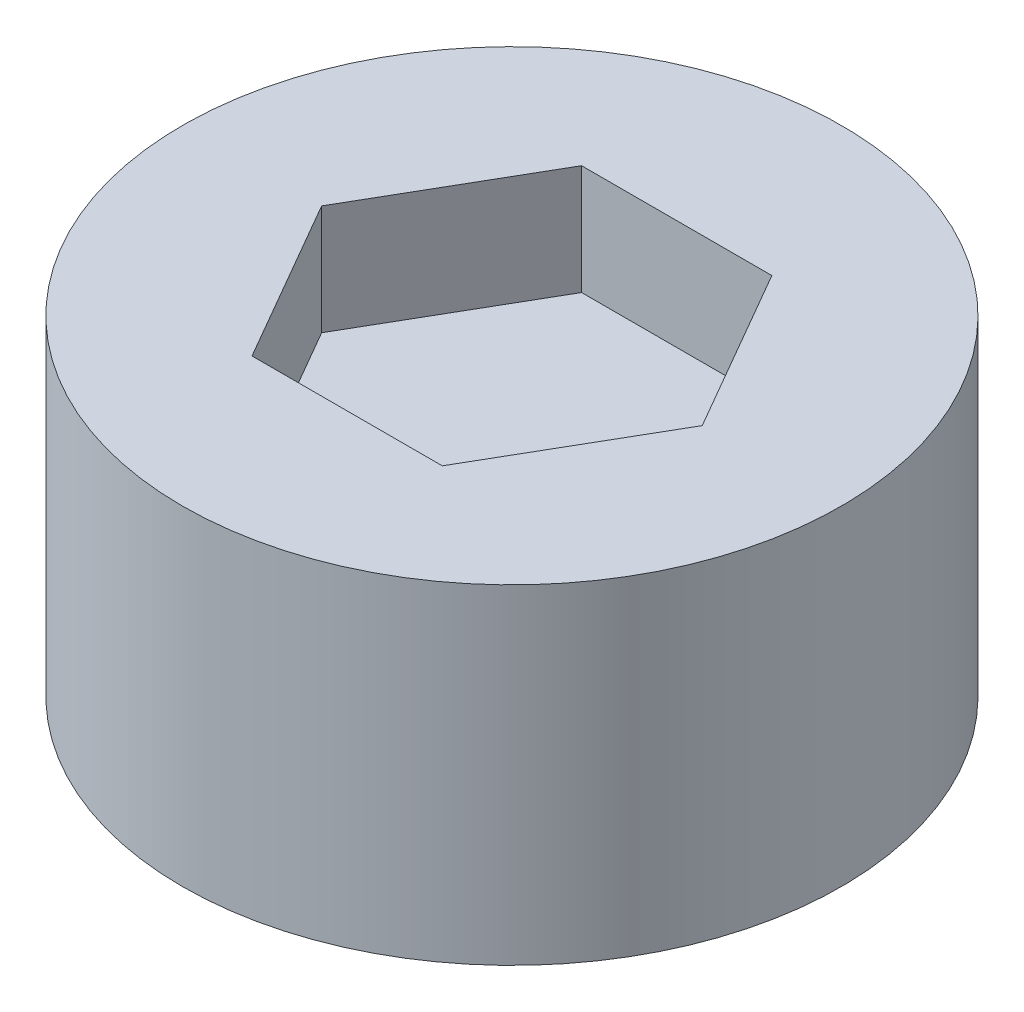
ISO-10303-21;
HEADER;
FILE_DESCRIPTION(('STEP AP214'),'2;1');
FILE_NAME('part.step','',(''),(''),'','','');
FILE_SCHEMA(('AUTOMOTIVE_DESIGN { 1 0 10303 214 1 1 1 1 }'));
ENDSEC;
DATA;
#1=APPLICATION_CONTEXT('core data for automotive mechanical design processes');
#2=APPLICATION_PROTOCOL_DEFINITION('international standard','automotive_design',2000,#1);
#3=PRODUCT_CONTEXT('',#1,'mechanical');
#4=PRODUCT('Part','Part','',(#3));
#5=PRODUCT_RELATED_PRODUCT_CATEGORY('part','',(#4));
#6=PRODUCT_DEFINITION_FORMATION('','',#4);
#7=PRODUCT_DEFINITION_CONTEXT('part definition',#1,'design');
#8=PRODUCT_DEFINITION('design','',#6,#7);
#9=PRODUCT_DEFINITION_SHAPE('','',#8);
#10=(LENGTH_UNIT() NAMED_UNIT(*) SI_UNIT(.MILLI.,.METRE.));
#11=(NAMED_UNIT(*) PLANE_ANGLE_UNIT() SI_UNIT($,.RADIAN.));
#12=(NAMED_UNIT(*) SI_UNIT($,.STERADIAN.) SOLID_ANGLE_UNIT());
#13=UNCERTAINTY_MEASURE_WITH_UNIT(LENGTH_MEASURE(1.E-05),#10,'distance_accuracy_value','');
#14=(GEOMETRIC_REPRESENTATION_CONTEXT(3) GLOBAL_UNCERTAINTY_ASSIGNED_CONTEXT((#13)) GLOBAL_UNIT_ASSIGNED_CONTEXT((#10,
#11,#12)) REPRESENTATION_CONTEXT('',''));
#15=CARTESIAN_POINT('',(0.,0.,0.));
#16=DIRECTION('',(0.,0.,1.));
#17=DIRECTION('',(1.,0.,0.));
#18=AXIS2_PLACEMENT_3D('',#15,#16,#17);
#19=CARTESIAN_POINT('',(0.,-1.5,0.));
#20=DIRECTION('',(0.,1.,0.));
#21=DIRECTION('',(0.,0.,1.));
#22=AXIS2_PLACEMENT_3D('',#19,#20,#21);
#23=CYLINDRICAL_SURFACE('',#22,1.5);
#24=CARTESIAN_POINT('',(0.,-1.5,0.));
#25=DIRECTION('',(0.,1.,0.));
#26=DIRECTION('',(0.,0.,1.));
#27=AXIS2_PLACEMENT_3D('',#24,#25,#26);
#28=CIRCLE('',#27,1.5);
#29=CARTESIAN_POINT('',(0.,-1.5,1.5));
#30=VERTEX_POINT('',#29);
#31=EDGE_CURVE('E11',#30,#30,#28,.T.);
#32=ORIENTED_EDGE('',*,*,#31,.T.);
#33=EDGE_LOOP('',(#32));
#34=FACE_BOUND('',#33,.T.);
#35=CARTESIAN_POINT('',(0.,0.,0.));
#36=DIRECTION('',(0.,1.,0.));
#37=DIRECTION('',(0.,0.,1.));
#38=AXIS2_PLACEMENT_3D('',#35,#36,#37);
#39=CIRCLE('',#38,1.5);
#40=CARTESIAN_POINT('',(0.,0.,1.5));
#41=VERTEX_POINT('',#40);
#42=EDGE_CURVE('E42',#41,#41,#39,.T.);
#43=ORIENTED_EDGE('',*,*,#42,.F.);
#44=EDGE_LOOP('',(#43));
#45=FACE_BOUND('',#44,.T.);
#46=ADVANCED_FACE('F39',(#34,#45),#23,.T.);
#47=CARTESIAN_POINT('',(0.,-1.5,0.));
#48=DIRECTION('',(0.,1.,0.));
#49=DIRECTION('',(0.,0.,1.));
#50=AXIS2_PLACEMENT_3D('',#47,#48,#49);
#51=PLANE('',#50);
#52=ORIENTED_EDGE('',*,*,#31,.F.);
#53=EDGE_LOOP('',(#52));
#54=FACE_BOUND('',#53,.T.);
#55=ADVANCED_FACE('F164',(#54),#51,.F.);
#56=CARTESIAN_POINT('',(0.,0.,0.));
#57=DIRECTION('',(0.,1.,0.));
#58=DIRECTION('',(0.,0.,1.));
#59=AXIS2_PLACEMENT_3D('',#56,#57,#58);
#60=PLANE('',#59);
#61=DIRECTION('',(1.,0.,0.));
#62=VECTOR('',#61,1.);
#63=CARTESIAN_POINT('',(-0.43301270189222,0.,0.75));
#64=LINE('',#63,#62);
#65=CARTESIAN_POINT('',(-0.43301270189222,0.,0.75));
#66=VERTEX_POINT('',#65);
#67=CARTESIAN_POINT('',(0.433012701892219,0.,0.75));
#68=VERTEX_POINT('',#67);
#69=EDGE_CURVE('E53',#66,#68,#64,.T.);
#70=ORIENTED_EDGE('',*,*,#69,.F.);
#71=DIRECTION('',(0.5,0.,0.866025403784439));
#72=VECTOR('',#71,1.);
#73=CARTESIAN_POINT('',(-0.866025403784439,0.,0.));
#74=LINE('',#73,#72);
#75=CARTESIAN_POINT('',(-0.866025403784439,0.,0.));
#76=VERTEX_POINT('',#75);
#77=EDGE_CURVE('E136',#76,#66,#74,.T.);
#78=ORIENTED_EDGE('',*,*,#77,.F.);
#79=DIRECTION('',(-0.5,0.,0.866025403784439));
#80=VECTOR('',#79,1.);
#81=CARTESIAN_POINT('',(-0.43301270189222,0.,-0.75));
#82=LINE('',#81,#80);
#83=CARTESIAN_POINT('',(-0.43301270189222,0.,-0.75));
#84=VERTEX_POINT('',#83);
#85=EDGE_CURVE('E134',#84,#76,#82,.T.);
#86=ORIENTED_EDGE('',*,*,#85,.F.);
#87=DIRECTION('',(-1.,0.,0.));
#88=VECTOR('',#87,1.);
#89=CARTESIAN_POINT('',(0.43301270189222,0.,-0.75));
#90=LINE('',#89,#88);
#91=CARTESIAN_POINT('',(0.43301270189222,0.,-0.75));
#92=VERTEX_POINT('',#91);
#93=EDGE_CURVE('E101',#92,#84,#90,.T.);
#94=ORIENTED_EDGE('',*,*,#93,.F.);
#95=DIRECTION('',(-0.5,0.,-0.866025403784439));
#96=VECTOR('',#95,1.);
#97=CARTESIAN_POINT('',(0.866025403784439,0.,0.));
#98=LINE('',#97,#96);
#99=CARTESIAN_POINT('',(0.866025403784439,0.,0.));
#100=VERTEX_POINT('',#99);
#101=EDGE_CURVE('E130',#100,#92,#98,.T.);
#102=ORIENTED_EDGE('',*,*,#101,.F.);
#103=DIRECTION('',(0.5,0.,-0.866025403784439));
#104=VECTOR('',#103,1.);
#105=CARTESIAN_POINT('',(0.433012701892219,0.,0.75));
#106=LINE('',#105,#104);
#107=EDGE_CURVE('E127',#68,#100,#106,.T.);
#108=ORIENTED_EDGE('',*,*,#107,.F.);
#109=EDGE_LOOP('',(#70,#78,#86,#94,#102,#108));
#110=FACE_BOUND('',#109,.T.);
#111=ORIENTED_EDGE('',*,*,#42,.T.);
#112=EDGE_LOOP('',(#111));
#113=FACE_BOUND('',#112,.T.);
#114=ADVANCED_FACE('F149',(#110,#113),#60,.T.);
#115=CARTESIAN_POINT('',(-0.43301270189222,-0.5,0.75));
#116=DIRECTION('',(0.,0.,1.));
#117=DIRECTION('',(1.,0.,0.));
#118=AXIS2_PLACEMENT_3D('',#115,#116,#117);
#119=PLANE('',#118);
#120=ORIENTED_EDGE('',*,*,#69,.T.);
#121=DIRECTION('',(0.,1.,0.));
#122=VECTOR('',#121,1.);
#123=CARTESIAN_POINT('',(0.433012701892219,-0.5,0.75));
#124=LINE('',#123,#122);
#125=CARTESIAN_POINT('',(0.433012701892219,-0.5,0.75));
#126=VERTEX_POINT('',#125);
#127=EDGE_CURVE('E83',#126,#68,#124,.T.);
#128=ORIENTED_EDGE('',*,*,#127,.F.);
#129=DIRECTION('',(1.,0.,0.));
#130=VECTOR('',#129,1.);
#131=CARTESIAN_POINT('',(-0.43301270189222,-0.5,0.75));
#132=LINE('',#131,#130);
#133=CARTESIAN_POINT('',(-0.43301270189222,-0.5,0.75));
#134=VERTEX_POINT('',#133);
#135=EDGE_CURVE('E138',#134,#126,#132,.T.);
#136=ORIENTED_EDGE('',*,*,#135,.F.);
#137=DIRECTION('',(0.,1.,0.));
#138=VECTOR('',#137,1.);
#139=CARTESIAN_POINT('',(-0.43301270189222,-0.5,0.75));
#140=LINE('',#139,#138);
#141=EDGE_CURVE('E61',#134,#66,#140,.T.);
#142=ORIENTED_EDGE('',*,*,#141,.T.);
#143=EDGE_LOOP('',(#120,#128,#136,#142));
#144=FACE_BOUND('',#143,.T.);
#145=ADVANCED_FACE('F155',(#144),#119,.F.);
#146=CARTESIAN_POINT('',(-0.866025403784439,-0.5,0.));
#147=DIRECTION('',(-0.866025403784439,0.,0.499999999999999));
#148=DIRECTION('',(0.5,0.,0.866025403784439));
#149=AXIS2_PLACEMENT_3D('',#146,#147,#148);
#150=PLANE('',#149);
#151=ORIENTED_EDGE('',*,*,#77,.T.);
#152=ORIENTED_EDGE('',*,*,#141,.F.);
#153=DIRECTION('',(0.5,0.,0.866025403784439));
#154=VECTOR('',#153,1.);
#155=CARTESIAN_POINT('',(-0.866025403784439,-0.5,0.));
#156=LINE('',#155,#154);
#157=CARTESIAN_POINT('',(-0.866025403784439,-0.5,0.));
#158=VERTEX_POINT('',#157);
#159=EDGE_CURVE('E113',#158,#134,#156,.T.);
#160=ORIENTED_EDGE('',*,*,#159,.F.);
#161=DIRECTION('',(0.,1.,0.));
#162=VECTOR('',#161,1.);
#163=CARTESIAN_POINT('',(-0.866025403784439,-0.5,0.));
#164=LINE('',#163,#162);
#165=EDGE_CURVE('E105',#158,#76,#164,.T.);
#166=ORIENTED_EDGE('',*,*,#165,.T.);
#167=EDGE_LOOP('',(#151,#152,#160,#166));
#168=FACE_BOUND('',#167,.T.);
#169=ADVANCED_FACE('F157',(#168),#150,.F.);
#170=CARTESIAN_POINT('',(-0.43301270189222,-0.5,-0.75));
#171=DIRECTION('',(-0.866025403784439,0.,-0.5));
#172=DIRECTION('',(-0.5,0.,0.866025403784439));
#173=AXIS2_PLACEMENT_3D('',#170,#171,#172);
#174=PLANE('',#173);
#175=ORIENTED_EDGE('',*,*,#85,.T.);
#176=ORIENTED_EDGE('',*,*,#165,.F.);
#177=DIRECTION('',(-0.5,0.,0.866025403784439));
#178=VECTOR('',#177,1.);
#179=CARTESIAN_POINT('',(-0.43301270189222,-0.5,-0.75));
#180=LINE('',#179,#178);
#181=CARTESIAN_POINT('',(-0.43301270189222,-0.5,-0.75));
#182=VERTEX_POINT('',#181);
#183=EDGE_CURVE('E109',#182,#158,#180,.T.);
#184=ORIENTED_EDGE('',*,*,#183,.F.);
#185=DIRECTION('',(0.,1.,0.));
#186=VECTOR('',#185,1.);
#187=CARTESIAN_POINT('',(-0.43301270189222,-0.5,-0.75));
#188=LINE('',#187,#186);
#189=EDGE_CURVE('E94',#182,#84,#188,.T.);
#190=ORIENTED_EDGE('',*,*,#189,.T.);
#191=EDGE_LOOP('',(#175,#176,#184,#190));
#192=FACE_BOUND('',#191,.T.);
#193=ADVANCED_FACE('F110',(#192),#174,.F.);
#194=CARTESIAN_POINT('',(0.43301270189222,-0.5,-0.75));
#195=DIRECTION('',(0.,0.,-1.));
#196=DIRECTION('',(-1.,0.,0.));
#197=AXIS2_PLACEMENT_3D('',#194,#195,#196);
#198=PLANE('',#197);
#199=ORIENTED_EDGE('',*,*,#93,.T.);
#200=ORIENTED_EDGE('',*,*,#189,.F.);
#201=DIRECTION('',(-1.,0.,0.));
#202=VECTOR('',#201,1.);
#203=CARTESIAN_POINT('',(0.43301270189222,-0.5,-0.75));
#204=LINE('',#203,#202);
#205=CARTESIAN_POINT('',(0.43301270189222,-0.5,-0.75));
#206=VERTEX_POINT('',#205);
#207=EDGE_CURVE('E98',#206,#182,#204,.T.);
#208=ORIENTED_EDGE('',*,*,#207,.F.);
#209=DIRECTION('',(0.,1.,0.));
#210=VECTOR('',#209,1.);
#211=CARTESIAN_POINT('',(0.43301270189222,-0.5,-0.75));
#212=LINE('',#211,#210);
#213=EDGE_CURVE('E106',#206,#92,#212,.T.);
#214=ORIENTED_EDGE('',*,*,#213,.T.);
#215=EDGE_LOOP('',(#199,#200,#208,#214));
#216=FACE_BOUND('',#215,.T.);
#217=ADVANCED_FACE('F96',(#216),#198,.F.);
#218=CARTESIAN_POINT('',(0.866025403784439,-0.5,0.));
#219=DIRECTION('',(0.866025403784439,0.,-0.5));
#220=DIRECTION('',(-0.5,0.,-0.866025403784439));
#221=AXIS2_PLACEMENT_3D('',#218,#219,#220);
#222=PLANE('',#221);
#223=ORIENTED_EDGE('',*,*,#101,.T.);
#224=ORIENTED_EDGE('',*,*,#213,.F.);
#225=DIRECTION('',(-0.5,0.,-0.866025403784439));
#226=VECTOR('',#225,1.);
#227=CARTESIAN_POINT('',(0.866025403784439,-0.5,0.));
#228=LINE('',#227,#226);
#229=CARTESIAN_POINT('',(0.866025403784439,-0.5,0.));
#230=VERTEX_POINT('',#229);
#231=EDGE_CURVE('E119',#230,#206,#228,.T.);
#232=ORIENTED_EDGE('',*,*,#231,.F.);
#233=DIRECTION('',(0.,1.,0.));
#234=VECTOR('',#233,1.);
#235=CARTESIAN_POINT('',(0.866025403784439,-0.5,0.));
#236=LINE('',#235,#234);
#237=EDGE_CURVE('E142',#230,#100,#236,.T.);
#238=ORIENTED_EDGE('',*,*,#237,.T.);
#239=EDGE_LOOP('',(#223,#224,#232,#238));
#240=FACE_BOUND('',#239,.T.);
#241=ADVANCED_FACE('F153',(#240),#222,.F.);
#242=CARTESIAN_POINT('',(0.433012701892219,-0.5,0.75));
#243=DIRECTION('',(0.866025403784439,0.,0.5));
#244=DIRECTION('',(0.5,0.,-0.866025403784439));
#245=AXIS2_PLACEMENT_3D('',#242,#243,#244);
#246=PLANE('',#245);
#247=ORIENTED_EDGE('',*,*,#107,.T.);
#248=ORIENTED_EDGE('',*,*,#237,.F.);
#249=DIRECTION('',(0.5,0.,-0.866025403784439));
#250=VECTOR('',#249,1.);
#251=CARTESIAN_POINT('',(0.433012701892219,-0.5,0.75));
#252=LINE('',#251,#250);
#253=EDGE_CURVE('E121',#126,#230,#252,.T.);
#254=ORIENTED_EDGE('',*,*,#253,.F.);
#255=ORIENTED_EDGE('',*,*,#127,.T.);
#256=EDGE_LOOP('',(#247,#248,#254,#255));
#257=FACE_BOUND('',#256,.T.);
#258=ADVANCED_FACE('F146',(#257),#246,.F.);
#259=CARTESIAN_POINT('',(0.,-0.5,0.));
#260=DIRECTION('',(0.,1.,0.));
#261=DIRECTION('',(0.,0.,1.));
#262=AXIS2_PLACEMENT_3D('',#259,#260,#261);
#263=PLANE('',#262);
#264=ORIENTED_EDGE('',*,*,#135,.T.);
#265=ORIENTED_EDGE('',*,*,#253,.T.);
#266=ORIENTED_EDGE('',*,*,#231,.T.);
#267=ORIENTED_EDGE('',*,*,#207,.T.);
#268=ORIENTED_EDGE('',*,*,#183,.T.);
#269=ORIENTED_EDGE('',*,*,#159,.T.);
#270=EDGE_LOOP('',(#264,#265,#266,#267,#268,#269));
#271=FACE_BOUND('',#270,.T.);
#272=ADVANCED_FACE('F116',(#271),#263,.T.);
#273=CLOSED_SHELL('',(#46,#55,#114,#145,#169,#193,#217,#241,#258,#272));
#274=MANIFOLD_SOLID_BREP('B2',#273);
#275=ADVANCED_BREP_SHAPE_REPRESENTATION('',(#18,#274),#14);
#276=SHAPE_DEFINITION_REPRESENTATION(#9,#275);
ENDSEC;
END-ISO-10303-21;
